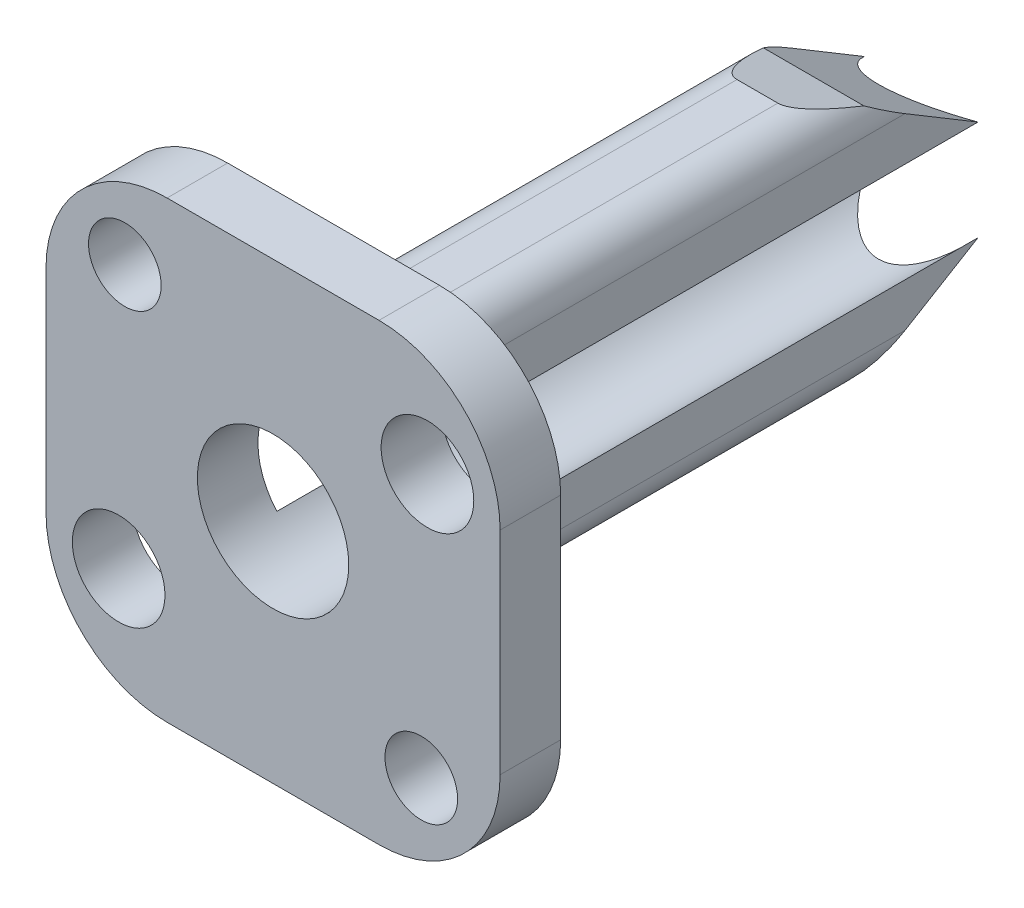
ISO-10303-21;
HEADER;
FILE_DESCRIPTION(('STEP AP214'),'2;1');
FILE_NAME('part.step','',(''),(''),'','','');
FILE_SCHEMA(('AUTOMOTIVE_DESIGN { 1 0 10303 214 1 1 1 1 }'));
ENDSEC;
DATA;
#1=APPLICATION_CONTEXT('core data for automotive mechanical design processes');
#2=APPLICATION_PROTOCOL_DEFINITION('international standard','automotive_design',2000,#1);
#3=PRODUCT_CONTEXT('',#1,'mechanical');
#4=PRODUCT('Part','Part','',(#3));
#5=PRODUCT_RELATED_PRODUCT_CATEGORY('part','',(#4));
#6=PRODUCT_DEFINITION_FORMATION('','',#4);
#7=PRODUCT_DEFINITION_CONTEXT('part definition',#1,'design');
#8=PRODUCT_DEFINITION('design','',#6,#7);
#9=PRODUCT_DEFINITION_SHAPE('','',#8);
#10=(LENGTH_UNIT() NAMED_UNIT(*) SI_UNIT(.MILLI.,.METRE.));
#11=(NAMED_UNIT(*) PLANE_ANGLE_UNIT() SI_UNIT($,.RADIAN.));
#12=(NAMED_UNIT(*) SI_UNIT($,.STERADIAN.) SOLID_ANGLE_UNIT());
#13=UNCERTAINTY_MEASURE_WITH_UNIT(LENGTH_MEASURE(1.E-05),#10,'distance_accuracy_value','');
#14=(GEOMETRIC_REPRESENTATION_CONTEXT(3) GLOBAL_UNCERTAINTY_ASSIGNED_CONTEXT((#13)) GLOBAL_UNIT_ASSIGNED_CONTEXT((#10,
#11,#12)) REPRESENTATION_CONTEXT('',''));
#15=CARTESIAN_POINT('',(0.,0.,0.));
#16=DIRECTION('',(0.,0.,1.));
#17=DIRECTION('',(1.,0.,0.));
#18=AXIS2_PLACEMENT_3D('',#15,#16,#17);
#19=CARTESIAN_POINT('',(0.,0.,0.));
#20=DIRECTION('',(0.,0.,1.));
#21=DIRECTION('',(1.,0.,0.));
#22=AXIS2_PLACEMENT_3D('',#19,#20,#21);
#23=PLANE('',#22);
#24=CARTESIAN_POINT('',(24.48,-24.48,0.));
#25=DIRECTION('',(0.,0.,1.));
#26=DIRECTION('',(1.,0.,0.));
#27=AXIS2_PLACEMENT_3D('',#24,#25,#26);
#28=CIRCLE('',#27,6.);
#29=CARTESIAN_POINT('',(30.48,-24.48,0.));
#30=VERTEX_POINT('',#29);
#31=EDGE_CURVE('E734',#30,#30,#28,.T.);
#32=ORIENTED_EDGE('',*,*,#31,.T.);
#33=EDGE_LOOP('',(#32));
#34=FACE_BOUND('',#33,.T.);
#35=CARTESIAN_POINT('',(-25.5,-19.5,0.));
#36=DIRECTION('',(0.,0.,1.));
#37=DIRECTION('',(1.,0.,0.));
#38=AXIS2_PLACEMENT_3D('',#35,#36,#37);
#39=CIRCLE('',#38,7.65);
#40=CARTESIAN_POINT('',(-17.85,-19.5,0.));
#41=VERTEX_POINT('',#40);
#42=EDGE_CURVE('E737',#41,#41,#39,.T.);
#43=ORIENTED_EDGE('',*,*,#42,.T.);
#44=EDGE_LOOP('',(#43));
#45=FACE_BOUND('',#44,.T.);
#46=CARTESIAN_POINT('',(-24.48,24.48,0.));
#47=DIRECTION('',(0.,0.,1.));
#48=DIRECTION('',(1.,0.,0.));
#49=AXIS2_PLACEMENT_3D('',#46,#47,#48);
#50=CIRCLE('',#49,6.);
#51=CARTESIAN_POINT('',(-18.48,24.48,0.));
#52=VERTEX_POINT('',#51);
#53=EDGE_CURVE('E697',#52,#52,#50,.T.);
#54=ORIENTED_EDGE('',*,*,#53,.T.);
#55=EDGE_LOOP('',(#54));
#56=FACE_BOUND('',#55,.T.);
#57=CARTESIAN_POINT('',(25.5,19.5,0.));
#58=DIRECTION('',(0.,0.,1.));
#59=DIRECTION('',(1.,0.,0.));
#60=AXIS2_PLACEMENT_3D('',#57,#58,#59);
#61=CIRCLE('',#60,7.65);
#62=CARTESIAN_POINT('',(33.15,19.5,0.));
#63=VERTEX_POINT('',#62);
#64=EDGE_CURVE('E207',#63,#63,#61,.T.);
#65=ORIENTED_EDGE('',*,*,#64,.T.);
#66=EDGE_LOOP('',(#65));
#67=FACE_BOUND('',#66,.T.);
#68=CARTESIAN_POINT('',(0.,0.,0.));
#69=DIRECTION('',(0.,0.,1.));
#70=DIRECTION('',(1.,0.,0.));
#71=AXIS2_PLACEMENT_3D('',#68,#69,#70);
#72=CIRCLE('',#71,12.5);
#73=CARTESIAN_POINT('',(-9.375,8.26797284707684,0.));
#74=VERTEX_POINT('',#73);
#75=CARTESIAN_POINT('',(-9.375,-8.26797284707685,0.));
#76=VERTEX_POINT('',#75);
#77=EDGE_CURVE('E206',#74,#76,#72,.T.);
#78=ORIENTED_EDGE('',*,*,#77,.T.);
#79=DIRECTION('',(0.,1.,0.));
#80=VECTOR('',#79,1.);
#81=CARTESIAN_POINT('',(-9.375,0.,0.));
#82=LINE('',#81,#80);
#83=CARTESIAN_POINT('',(-9.375,-15.5,0.));
#84=VERTEX_POINT('',#83);
#85=EDGE_CURVE('E240',#84,#76,#82,.T.);
#86=ORIENTED_EDGE('',*,*,#85,.F.);
#87=CARTESIAN_POINT('',(-3.375,-15.5,0.));
#88=DIRECTION('',(0.,0.,1.));
#89=DIRECTION('',(1.,0.,0.));
#90=AXIS2_PLACEMENT_3D('',#87,#88,#89);
#91=CIRCLE('',#90,6.);
#92=CARTESIAN_POINT('',(-3.375,-21.5,0.));
#93=VERTEX_POINT('',#92);
#94=EDGE_CURVE('E328',#84,#93,#91,.T.);
#95=ORIENTED_EDGE('',*,*,#94,.T.);
#96=DIRECTION('',(-1.,0.,0.));
#97=VECTOR('',#96,1.);
#98=CARTESIAN_POINT('',(0.,-21.5,0.));
#99=LINE('',#98,#97);
#100=CARTESIAN_POINT('',(3.375,-21.5,0.));
#101=VERTEX_POINT('',#100);
#102=EDGE_CURVE('E702',#101,#93,#99,.T.);
#103=ORIENTED_EDGE('',*,*,#102,.F.);
#104=CARTESIAN_POINT('',(3.375,-15.5,0.));
#105=DIRECTION('',(0.,0.,1.));
#106=DIRECTION('',(1.,0.,0.));
#107=AXIS2_PLACEMENT_3D('',#104,#105,#106);
#108=CIRCLE('',#107,6.);
#109=CARTESIAN_POINT('',(9.375,-15.5,0.));
#110=VERTEX_POINT('',#109);
#111=EDGE_CURVE('E330',#101,#110,#108,.T.);
#112=ORIENTED_EDGE('',*,*,#111,.T.);
#113=DIRECTION('',(0.,1.,0.));
#114=VECTOR('',#113,1.);
#115=CARTESIAN_POINT('',(9.375,0.,0.));
#116=LINE('',#115,#114);
#117=CARTESIAN_POINT('',(9.375,-8.26797284707684,0.));
#118=VERTEX_POINT('',#117);
#119=EDGE_CURVE('E202',#110,#118,#116,.T.);
#120=ORIENTED_EDGE('',*,*,#119,.T.);
#121=CARTESIAN_POINT('',(9.375,8.26797284707684,0.));
#122=VERTEX_POINT('',#121);
#123=EDGE_CURVE('E195',#118,#122,#72,.T.);
#124=ORIENTED_EDGE('',*,*,#123,.T.);
#125=DIRECTION('',(0.,1.,0.));
#126=VECTOR('',#125,1.);
#127=CARTESIAN_POINT('',(9.375,0.,0.));
#128=LINE('',#127,#126);
#129=CARTESIAN_POINT('',(9.375,15.5,0.));
#130=VERTEX_POINT('',#129);
#131=EDGE_CURVE('E200',#122,#130,#128,.T.);
#132=ORIENTED_EDGE('',*,*,#131,.T.);
#133=CARTESIAN_POINT('',(3.375,15.5,0.));
#134=DIRECTION('',(0.,0.,1.));
#135=DIRECTION('',(1.,0.,0.));
#136=AXIS2_PLACEMENT_3D('',#133,#134,#135);
#137=CIRCLE('',#136,6.);
#138=CARTESIAN_POINT('',(3.375,21.5,0.));
#139=VERTEX_POINT('',#138);
#140=EDGE_CURVE('E324',#130,#139,#137,.T.);
#141=ORIENTED_EDGE('',*,*,#140,.T.);
#142=DIRECTION('',(-1.,0.,0.));
#143=VECTOR('',#142,1.);
#144=CARTESIAN_POINT('',(0.,21.5,0.));
#145=LINE('',#144,#143);
#146=CARTESIAN_POINT('',(-3.375,21.5,0.));
#147=VERTEX_POINT('',#146);
#148=EDGE_CURVE('E226',#139,#147,#145,.T.);
#149=ORIENTED_EDGE('',*,*,#148,.T.);
#150=CARTESIAN_POINT('',(-3.375,15.5,0.));
#151=DIRECTION('',(0.,0.,1.));
#152=DIRECTION('',(1.,0.,0.));
#153=AXIS2_PLACEMENT_3D('',#150,#151,#152);
#154=CIRCLE('',#153,6.);
#155=CARTESIAN_POINT('',(-9.375,15.5,0.));
#156=VERTEX_POINT('',#155);
#157=EDGE_CURVE('E326',#147,#156,#154,.T.);
#158=ORIENTED_EDGE('',*,*,#157,.T.);
#159=DIRECTION('',(0.,1.,0.));
#160=VECTOR('',#159,1.);
#161=CARTESIAN_POINT('',(-9.375,0.,0.));
#162=LINE('',#161,#160);
#163=EDGE_CURVE('E220',#74,#156,#162,.T.);
#164=ORIENTED_EDGE('',*,*,#163,.F.);
#165=EDGE_LOOP('',(#78,#86,#95,#103,#112,#120,#124,#132,#141,#149,#158,#164));
#166=FACE_BOUND('',#165,.T.);
#167=DIRECTION('',(0.,1.,0.));
#168=VECTOR('',#167,1.);
#169=CARTESIAN_POINT('',(-37.5,0.,0.));
#170=LINE('',#169,#168);
#171=CARTESIAN_POINT('',(-37.5,-17.5,0.));
#172=VERTEX_POINT('',#171);
#173=CARTESIAN_POINT('',(-37.5,17.5,0.));
#174=VERTEX_POINT('',#173);
#175=EDGE_CURVE('E262',#172,#174,#170,.T.);
#176=ORIENTED_EDGE('',*,*,#175,.T.);
#177=CARTESIAN_POINT('',(-17.5,17.5,0.));
#178=DIRECTION('',(0.,0.,1.));
#179=DIRECTION('',(1.,0.,0.));
#180=AXIS2_PLACEMENT_3D('',#177,#178,#179);
#181=CIRCLE('',#180,20.);
#182=CARTESIAN_POINT('',(-17.5,37.5,0.));
#183=VERTEX_POINT('',#182);
#184=EDGE_CURVE('E343',#174,#183,#181,.F.);
#185=ORIENTED_EDGE('',*,*,#184,.T.);
#186=DIRECTION('',(-1.,0.,0.));
#187=VECTOR('',#186,1.);
#188=CARTESIAN_POINT('',(0.,37.5,0.));
#189=LINE('',#188,#187);
#190=CARTESIAN_POINT('',(17.5,37.5,0.));
#191=VERTEX_POINT('',#190);
#192=EDGE_CURVE('E258',#191,#183,#189,.T.);
#193=ORIENTED_EDGE('',*,*,#192,.F.);
#194=CARTESIAN_POINT('',(17.5,17.5,0.));
#195=DIRECTION('',(0.,0.,1.));
#196=DIRECTION('',(1.,0.,0.));
#197=AXIS2_PLACEMENT_3D('',#194,#195,#196);
#198=CIRCLE('',#197,20.);
#199=CARTESIAN_POINT('',(37.5,17.5,0.));
#200=VERTEX_POINT('',#199);
#201=EDGE_CURVE('E341',#191,#200,#198,.F.);
#202=ORIENTED_EDGE('',*,*,#201,.T.);
#203=DIRECTION('',(0.,1.,0.));
#204=VECTOR('',#203,1.);
#205=CARTESIAN_POINT('',(37.5,0.,0.));
#206=LINE('',#205,#204);
#207=CARTESIAN_POINT('',(37.5,-17.5,0.));
#208=VERTEX_POINT('',#207);
#209=EDGE_CURVE('E255',#208,#200,#206,.T.);
#210=ORIENTED_EDGE('',*,*,#209,.F.);
#211=CARTESIAN_POINT('',(17.5,-17.5,0.));
#212=DIRECTION('',(0.,0.,1.));
#213=DIRECTION('',(1.,0.,0.));
#214=AXIS2_PLACEMENT_3D('',#211,#212,#213);
#215=CIRCLE('',#214,20.);
#216=CARTESIAN_POINT('',(17.5,-37.5,0.));
#217=VERTEX_POINT('',#216);
#218=EDGE_CURVE('E337',#208,#217,#215,.F.);
#219=ORIENTED_EDGE('',*,*,#218,.T.);
#220=DIRECTION('',(-1.,0.,0.));
#221=VECTOR('',#220,1.);
#222=CARTESIAN_POINT('',(0.,-37.5,0.));
#223=LINE('',#222,#221);
#224=CARTESIAN_POINT('',(-17.5,-37.5,0.));
#225=VERTEX_POINT('',#224);
#226=EDGE_CURVE('E246',#217,#225,#223,.T.);
#227=ORIENTED_EDGE('',*,*,#226,.T.);
#228=CARTESIAN_POINT('',(-17.5,-17.5,0.));
#229=DIRECTION('',(0.,0.,1.));
#230=DIRECTION('',(1.,0.,0.));
#231=AXIS2_PLACEMENT_3D('',#228,#229,#230);
#232=CIRCLE('',#231,20.);
#233=EDGE_CURVE('E339',#225,#172,#232,.F.);
#234=ORIENTED_EDGE('',*,*,#233,.T.);
#235=EDGE_LOOP('',(#176,#185,#193,#202,#210,#219,#227,#234));
#236=FACE_BOUND('',#235,.T.);
#237=ADVANCED_FACE('F45',(#34,#45,#56,#67,#166,#236),#23,.F.);
#238=CARTESIAN_POINT('',(37.5,0.,10.));
#239=DIRECTION('',(-1.,0.,0.));
#240=DIRECTION('',(0.,-1.,0.));
#241=AXIS2_PLACEMENT_3D('',#238,#239,#240);
#242=PLANE('',#241);
#243=ORIENTED_EDGE('',*,*,#209,.T.);
#244=DIRECTION('',(0.,0.,-1.));
#245=VECTOR('',#244,1.);
#246=CARTESIAN_POINT('',(37.5,17.5,10.));
#247=LINE('',#246,#245);
#248=CARTESIAN_POINT('',(37.5,17.5,10.));
#249=VERTEX_POINT('',#248);
#250=EDGE_CURVE('E360',#200,#249,#247,.F.);
#251=ORIENTED_EDGE('',*,*,#250,.T.);
#252=DIRECTION('',(0.,1.,0.));
#253=VECTOR('',#252,1.);
#254=CARTESIAN_POINT('',(37.5,0.,10.));
#255=LINE('',#254,#253);
#256=CARTESIAN_POINT('',(37.5,-17.5,10.));
#257=VERTEX_POINT('',#256);
#258=EDGE_CURVE('E242',#257,#249,#255,.T.);
#259=ORIENTED_EDGE('',*,*,#258,.F.);
#260=DIRECTION('',(0.,0.,-1.));
#261=VECTOR('',#260,1.);
#262=CARTESIAN_POINT('',(37.5,-17.5,0.));
#263=LINE('',#262,#261);
#264=EDGE_CURVE('E357',#257,#208,#263,.T.);
#265=ORIENTED_EDGE('',*,*,#264,.T.);
#266=EDGE_LOOP('',(#243,#251,#259,#265));
#267=FACE_BOUND('',#266,.T.);
#268=ADVANCED_FACE('F364',(#267),#242,.F.);
#269=CARTESIAN_POINT('',(0.,37.5,10.));
#270=DIRECTION('',(0.,-1.,0.));
#271=DIRECTION('',(0.,0.,-1.));
#272=AXIS2_PLACEMENT_3D('',#269,#270,#271);
#273=PLANE('',#272);
#274=ORIENTED_EDGE('',*,*,#192,.T.);
#275=DIRECTION('',(0.,0.,-1.));
#276=VECTOR('',#275,1.);
#277=CARTESIAN_POINT('',(-17.5,37.5,10.));
#278=LINE('',#277,#276);
#279=CARTESIAN_POINT('',(-17.5,37.5,10.));
#280=VERTEX_POINT('',#279);
#281=EDGE_CURVE('E348',#183,#280,#278,.F.);
#282=ORIENTED_EDGE('',*,*,#281,.T.);
#283=DIRECTION('',(-1.,0.,0.));
#284=VECTOR('',#283,1.);
#285=CARTESIAN_POINT('',(0.,37.5,10.));
#286=LINE('',#285,#284);
#287=CARTESIAN_POINT('',(17.5,37.5,10.));
#288=VERTEX_POINT('',#287);
#289=EDGE_CURVE('E245',#288,#280,#286,.T.);
#290=ORIENTED_EDGE('',*,*,#289,.F.);
#291=DIRECTION('',(0.,0.,-1.));
#292=VECTOR('',#291,1.);
#293=CARTESIAN_POINT('',(17.5,37.5,10.));
#294=LINE('',#293,#292);
#295=EDGE_CURVE('E345',#288,#191,#294,.T.);
#296=ORIENTED_EDGE('',*,*,#295,.T.);
#297=EDGE_LOOP('',(#274,#282,#290,#296));
#298=FACE_BOUND('',#297,.T.);
#299=ADVANCED_FACE('F376',(#298),#273,.F.);
#300=CARTESIAN_POINT('',(-37.5,0.,10.));
#301=DIRECTION('',(-1.,0.,0.));
#302=DIRECTION('',(0.,-1.,0.));
#303=AXIS2_PLACEMENT_3D('',#300,#301,#302);
#304=PLANE('',#303);
#305=DIRECTION('',(0.,1.,0.));
#306=VECTOR('',#305,1.);
#307=CARTESIAN_POINT('',(-37.5,0.,10.));
#308=LINE('',#307,#306);
#309=CARTESIAN_POINT('',(-37.5,-17.5,10.));
#310=VERTEX_POINT('',#309);
#311=CARTESIAN_POINT('',(-37.5,17.5,10.));
#312=VERTEX_POINT('',#311);
#313=EDGE_CURVE('E249',#310,#312,#308,.T.);
#314=ORIENTED_EDGE('',*,*,#313,.T.);
#315=DIRECTION('',(0.,0.,-1.));
#316=VECTOR('',#315,1.);
#317=CARTESIAN_POINT('',(-37.5,17.5,0.));
#318=LINE('',#317,#316);
#319=EDGE_CURVE('E334',#312,#174,#318,.T.);
#320=ORIENTED_EDGE('',*,*,#319,.T.);
#321=ORIENTED_EDGE('',*,*,#175,.F.);
#322=DIRECTION('',(0.,0.,-1.));
#323=VECTOR('',#322,1.);
#324=CARTESIAN_POINT('',(-37.5,-17.5,10.));
#325=LINE('',#324,#323);
#326=EDGE_CURVE('E332',#172,#310,#325,.F.);
#327=ORIENTED_EDGE('',*,*,#326,.T.);
#328=EDGE_LOOP('',(#314,#320,#321,#327));
#329=FACE_BOUND('',#328,.T.);
#330=ADVANCED_FACE('F384',(#329),#304,.T.);
#331=CARTESIAN_POINT('',(0.,-37.5,10.));
#332=DIRECTION('',(0.,-1.,0.));
#333=DIRECTION('',(1.,0.,0.));
#334=AXIS2_PLACEMENT_3D('',#331,#332,#333);
#335=PLANE('',#334);
#336=DIRECTION('',(-1.,0.,0.));
#337=VECTOR('',#336,1.);
#338=CARTESIAN_POINT('',(0.,-37.5,10.));
#339=LINE('',#338,#337);
#340=CARTESIAN_POINT('',(17.5,-37.5,10.));
#341=VERTEX_POINT('',#340);
#342=CARTESIAN_POINT('',(-17.5,-37.5,10.));
#343=VERTEX_POINT('',#342);
#344=EDGE_CURVE('E252',#341,#343,#339,.T.);
#345=ORIENTED_EDGE('',*,*,#344,.T.);
#346=DIRECTION('',(0.,0.,-1.));
#347=VECTOR('',#346,1.);
#348=CARTESIAN_POINT('',(-17.5,-37.5,10.));
#349=LINE('',#348,#347);
#350=EDGE_CURVE('E11',#343,#225,#349,.T.);
#351=ORIENTED_EDGE('',*,*,#350,.T.);
#352=ORIENTED_EDGE('',*,*,#226,.F.);
#353=DIRECTION('',(0.,0.,-1.));
#354=VECTOR('',#353,1.);
#355=CARTESIAN_POINT('',(17.5,-37.5,10.));
#356=LINE('',#355,#354);
#357=EDGE_CURVE('E53',#217,#341,#356,.F.);
#358=ORIENTED_EDGE('',*,*,#357,.T.);
#359=EDGE_LOOP('',(#345,#351,#352,#358));
#360=FACE_BOUND('',#359,.T.);
#361=ADVANCED_FACE('F389',(#360),#335,.T.);
#362=CARTESIAN_POINT('',(0.,0.,10.));
#363=DIRECTION('',(0.,0.,1.));
#364=DIRECTION('',(1.,0.,0.));
#365=AXIS2_PLACEMENT_3D('',#362,#363,#364);
#366=PLANE('',#365);
#367=CARTESIAN_POINT('',(24.48,-24.48,10.));
#368=DIRECTION('',(0.,0.,1.));
#369=DIRECTION('',(1.,0.,0.));
#370=AXIS2_PLACEMENT_3D('',#367,#368,#369);
#371=CIRCLE('',#370,6.);
#372=CARTESIAN_POINT('',(30.48,-24.48,10.));
#373=VERTEX_POINT('',#372);
#374=EDGE_CURVE('E679',#373,#373,#371,.T.);
#375=ORIENTED_EDGE('',*,*,#374,.F.);
#376=EDGE_LOOP('',(#375));
#377=FACE_BOUND('',#376,.T.);
#378=CARTESIAN_POINT('',(-25.5,-19.5,10.));
#379=DIRECTION('',(0.,0.,1.));
#380=DIRECTION('',(1.,0.,0.));
#381=AXIS2_PLACEMENT_3D('',#378,#379,#380);
#382=CIRCLE('',#381,7.65);
#383=CARTESIAN_POINT('',(-17.85,-19.5,10.));
#384=VERTEX_POINT('',#383);
#385=EDGE_CURVE('E683',#384,#384,#382,.T.);
#386=ORIENTED_EDGE('',*,*,#385,.F.);
#387=EDGE_LOOP('',(#386));
#388=FACE_BOUND('',#387,.T.);
#389=CARTESIAN_POINT('',(-24.48,24.48,10.));
#390=DIRECTION('',(0.,0.,1.));
#391=DIRECTION('',(1.,0.,0.));
#392=AXIS2_PLACEMENT_3D('',#389,#390,#391);
#393=CIRCLE('',#392,6.);
#394=CARTESIAN_POINT('',(-18.48,24.48,10.));
#395=VERTEX_POINT('',#394);
#396=EDGE_CURVE('E687',#395,#395,#393,.T.);
#397=ORIENTED_EDGE('',*,*,#396,.F.);
#398=EDGE_LOOP('',(#397));
#399=FACE_BOUND('',#398,.T.);
#400=CARTESIAN_POINT('',(25.5,19.5,10.));
#401=DIRECTION('',(0.,0.,1.));
#402=DIRECTION('',(1.,0.,0.));
#403=AXIS2_PLACEMENT_3D('',#400,#401,#402);
#404=CIRCLE('',#403,7.65);
#405=CARTESIAN_POINT('',(33.15,19.5,10.));
#406=VERTEX_POINT('',#405);
#407=EDGE_CURVE('E691',#406,#406,#404,.T.);
#408=ORIENTED_EDGE('',*,*,#407,.F.);
#409=EDGE_LOOP('',(#408));
#410=FACE_BOUND('',#409,.T.);
#411=CARTESIAN_POINT('',(0.,0.,10.));
#412=DIRECTION('',(0.,0.,1.));
#413=DIRECTION('',(1.,0.,0.));
#414=AXIS2_PLACEMENT_3D('',#411,#412,#413);
#415=CIRCLE('',#414,12.5);
#416=CARTESIAN_POINT('',(12.5,0.,10.));
#417=VERTEX_POINT('',#416);
#418=EDGE_CURVE('E227',#417,#417,#415,.T.);
#419=ORIENTED_EDGE('',*,*,#418,.F.);
#420=EDGE_LOOP('',(#419));
#421=FACE_BOUND('',#420,.T.);
#422=ORIENTED_EDGE('',*,*,#289,.T.);
#423=CARTESIAN_POINT('',(-17.5,17.5,10.));
#424=DIRECTION('',(0.,0.,1.));
#425=DIRECTION('',(1.,0.,0.));
#426=AXIS2_PLACEMENT_3D('',#423,#424,#425);
#427=CIRCLE('',#426,20.);
#428=EDGE_CURVE('E355',#280,#312,#427,.T.);
#429=ORIENTED_EDGE('',*,*,#428,.T.);
#430=ORIENTED_EDGE('',*,*,#313,.F.);
#431=CARTESIAN_POINT('',(-17.5,-17.5,10.));
#432=DIRECTION('',(0.,0.,1.));
#433=DIRECTION('',(1.,0.,0.));
#434=AXIS2_PLACEMENT_3D('',#431,#432,#433);
#435=CIRCLE('',#434,20.);
#436=EDGE_CURVE('E60',#310,#343,#435,.T.);
#437=ORIENTED_EDGE('',*,*,#436,.T.);
#438=ORIENTED_EDGE('',*,*,#344,.F.);
#439=CARTESIAN_POINT('',(17.5,-17.5,10.));
#440=DIRECTION('',(0.,0.,1.));
#441=DIRECTION('',(1.,0.,0.));
#442=AXIS2_PLACEMENT_3D('',#439,#440,#441);
#443=CIRCLE('',#442,20.);
#444=EDGE_CURVE('E350',#341,#257,#443,.T.);
#445=ORIENTED_EDGE('',*,*,#444,.T.);
#446=ORIENTED_EDGE('',*,*,#258,.T.);
#447=CARTESIAN_POINT('',(17.5,17.5,10.));
#448=DIRECTION('',(0.,0.,1.));
#449=DIRECTION('',(1.,0.,0.));
#450=AXIS2_PLACEMENT_3D('',#447,#448,#449);
#451=CIRCLE('',#450,20.);
#452=EDGE_CURVE('E353',#249,#288,#451,.T.);
#453=ORIENTED_EDGE('',*,*,#452,.T.);
#454=EDGE_LOOP('',(#422,#429,#430,#437,#438,#445,#446,#453));
#455=FACE_BOUND('',#454,.T.);
#456=ADVANCED_FACE('F369',(#377,#388,#399,#410,#421,#455),#366,.T.);
#457=CARTESIAN_POINT('',(-9.375,0.,-100.));
#458=DIRECTION('',(1.,0.,0.));
#459=DIRECTION('',(0.,1.,0.));
#460=AXIS2_PLACEMENT_3D('',#457,#458,#459);
#461=PLANE('',#460);
#462=ORIENTED_EDGE('',*,*,#163,.T.);
#463=DIRECTION('',(0.,0.,1.));
#464=VECTOR('',#463,1.);
#465=CARTESIAN_POINT('',(-9.375,15.5,-69.9999999999998));
#466=LINE('',#465,#464);
#467=CARTESIAN_POINT('',(-9.375,15.5,-84.9999999999998));
#468=VERTEX_POINT('',#467);
#469=EDGE_CURVE('E304',#156,#468,#466,.F.);
#470=ORIENTED_EDGE('',*,*,#469,.T.);
#471=DIRECTION('',(0.,-0.514495755427529,-0.857492925712543));
#472=VECTOR('',#471,1.);
#473=CARTESIAN_POINT('',(-9.37500000000001,21.5,-74.9999999999999));
#474=LINE('',#473,#472);
#475=CARTESIAN_POINT('',(-9.375,8.26797284707684,-97.053378588205));
#476=VERTEX_POINT('',#475);
#477=EDGE_CURVE('E254',#468,#476,#474,.T.);
#478=ORIENTED_EDGE('',*,*,#477,.T.);
#479=DIRECTION('',(0.,0.,1.));
#480=VECTOR('',#479,1.);
#481=CARTESIAN_POINT('',(-9.375,8.26797284707684,-100.));
#482=LINE('',#481,#480);
#483=EDGE_CURVE('E219',#476,#74,#482,.T.);
#484=ORIENTED_EDGE('',*,*,#483,.T.);
#485=EDGE_LOOP('',(#462,#470,#478,#484));
#486=FACE_BOUND('',#485,.T.);
#487=ADVANCED_FACE('F535',(#486),#461,.F.);
#488=CARTESIAN_POINT('',(0.,21.5,-100.));
#489=DIRECTION('',(0.,1.,0.));
#490=DIRECTION('',(0.,0.,1.));
#491=AXIS2_PLACEMENT_3D('',#488,#489,#490);
#492=PLANE('',#491);
#493=ORIENTED_EDGE('',*,*,#148,.F.);
#494=DIRECTION('',(0.,0.,1.));
#495=VECTOR('',#494,1.);
#496=CARTESIAN_POINT('',(3.375,21.5,-100.));
#497=LINE('',#496,#495);
#498=CARTESIAN_POINT('',(3.375,21.5,-69.9999999999998));
#499=VERTEX_POINT('',#498);
#500=EDGE_CURVE('E294',#139,#499,#497,.F.);
#501=ORIENTED_EDGE('',*,*,#500,.T.);
#502=DIRECTION('',(-1.,0.,0.));
#503=VECTOR('',#502,1.);
#504=CARTESIAN_POINT('',(0.,21.5,-69.9999999999998));
#505=LINE('',#504,#503);
#506=CARTESIAN_POINT('',(-3.375,21.5,-69.9999999999998));
#507=VERTEX_POINT('',#506);
#508=EDGE_CURVE('E278',#499,#507,#505,.T.);
#509=ORIENTED_EDGE('',*,*,#508,.T.);
#510=DIRECTION('',(0.,0.,1.));
#511=VECTOR('',#510,1.);
#512=CARTESIAN_POINT('',(-3.375,21.5,0.));
#513=LINE('',#512,#511);
#514=EDGE_CURVE('E291',#507,#147,#513,.T.);
#515=ORIENTED_EDGE('',*,*,#514,.T.);
#516=EDGE_LOOP('',(#493,#501,#509,#515));
#517=FACE_BOUND('',#516,.T.);
#518=ADVANCED_FACE('F538',(#517),#492,.T.);
#519=CARTESIAN_POINT('',(9.375,0.,-100.));
#520=DIRECTION('',(1.,0.,0.));
#521=DIRECTION('',(0.,1.,0.));
#522=AXIS2_PLACEMENT_3D('',#519,#520,#521);
#523=PLANE('',#522);
#524=DIRECTION('',(0.,0.514495755427529,0.857492925712543));
#525=VECTOR('',#524,1.);
#526=CARTESIAN_POINT('',(9.375,4.77941176470572,-102.867647058823));
#527=LINE('',#526,#525);
#528=CARTESIAN_POINT('',(9.375,8.26797284707684,-97.053378588205));
#529=VERTEX_POINT('',#528);
#530=CARTESIAN_POINT('',(9.375,15.5,-84.9999999999998));
#531=VERTEX_POINT('',#530);
#532=EDGE_CURVE('E269',#529,#531,#527,.T.);
#533=ORIENTED_EDGE('',*,*,#532,.T.);
#534=DIRECTION('',(0.,0.,1.));
#535=VECTOR('',#534,1.);
#536=CARTESIAN_POINT('',(9.375,15.5,-100.));
#537=LINE('',#536,#535);
#538=EDGE_CURVE('E225',#531,#130,#537,.T.);
#539=ORIENTED_EDGE('',*,*,#538,.T.);
#540=ORIENTED_EDGE('',*,*,#131,.F.);
#541=DIRECTION('',(0.,0.,1.));
#542=VECTOR('',#541,1.);
#543=CARTESIAN_POINT('',(9.375,8.26797284707684,-100.));
#544=LINE('',#543,#542);
#545=EDGE_CURVE('E210',#529,#122,#544,.T.);
#546=ORIENTED_EDGE('',*,*,#545,.F.);
#547=EDGE_LOOP('',(#533,#539,#540,#546));
#548=FACE_BOUND('',#547,.T.);
#549=ADVANCED_FACE('F223',(#548),#523,.T.);
#550=CARTESIAN_POINT('',(0.,0.,-100.));
#551=DIRECTION('',(0.,0.,1.));
#552=DIRECTION('',(1.,0.,0.));
#553=AXIS2_PLACEMENT_3D('',#550,#551,#552);
#554=CYLINDRICAL_SURFACE('',#553,12.5);
#555=DIRECTION('',(0.,0.,1.));
#556=VECTOR('',#555,1.);
#557=CARTESIAN_POINT('',(9.375,-8.26797284707684,-100.));
#558=LINE('',#557,#556);
#559=CARTESIAN_POINT('',(9.375,-8.26797284707684,-97.053378588205));
#560=VERTEX_POINT('',#559);
#561=EDGE_CURVE('E259',#560,#118,#558,.T.);
#562=ORIENTED_EDGE('',*,*,#561,.F.);
#563=CARTESIAN_POINT('',(0.,0.,-110.833333333333));
#564=DIRECTION('',(0.,0.857492925712542,0.514495755427529));
#565=DIRECTION('',(0.,-0.514495755427529,0.857492925712543));
#566=AXIS2_PLACEMENT_3D('',#563,#564,#565);
#567=ELLIPSE('',#566,24.2956328951886,12.5);
#568=CARTESIAN_POINT('',(-9.375,-8.26797284707685,-97.053378588205));
#569=VERTEX_POINT('',#568);
#570=EDGE_CURVE('E271',#560,#569,#567,.F.);
#571=ORIENTED_EDGE('',*,*,#570,.T.);
#572=DIRECTION('',(0.,0.,1.));
#573=VECTOR('',#572,1.);
#574=CARTESIAN_POINT('',(-9.375,-8.26797284707685,-100.));
#575=LINE('',#574,#573);
#576=EDGE_CURVE('E234',#569,#76,#575,.T.);
#577=ORIENTED_EDGE('',*,*,#576,.T.);
#578=ORIENTED_EDGE('',*,*,#77,.F.);
#579=ORIENTED_EDGE('',*,*,#483,.F.);
#580=CARTESIAN_POINT('',(0.,0.,-110.833333333333));
#581=DIRECTION('',(0.,0.857492925712542,-0.514495755427529));
#582=DIRECTION('',(0.,0.514495755427529,0.857492925712543));
#583=AXIS2_PLACEMENT_3D('',#580,#581,#582);
#584=ELLIPSE('',#583,24.2956328951886,12.5);
#585=EDGE_CURVE('E215',#476,#529,#584,.T.);
#586=ORIENTED_EDGE('',*,*,#585,.T.);
#587=ORIENTED_EDGE('',*,*,#545,.T.);
#588=ORIENTED_EDGE('',*,*,#123,.F.);
#589=EDGE_LOOP('',(#562,#571,#577,#578,#579,#586,#587,#588));
#590=FACE_BOUND('',#589,.T.);
#591=ORIENTED_EDGE('',*,*,#418,.T.);
#592=EDGE_LOOP('',(#591));
#593=FACE_BOUND('',#592,.T.);
#594=ADVANCED_FACE('F211',(#590,#593),#554,.F.);
#595=CARTESIAN_POINT('',(9.375,0.,-100.));
#596=DIRECTION('',(1.,0.,0.));
#597=DIRECTION('',(0.,1.,0.));
#598=AXIS2_PLACEMENT_3D('',#595,#596,#597);
#599=PLANE('',#598);
#600=ORIENTED_EDGE('',*,*,#119,.F.);
#601=DIRECTION('',(0.,0.,1.));
#602=VECTOR('',#601,1.);
#603=CARTESIAN_POINT('',(9.375,-15.5,-69.9999999999998));
#604=LINE('',#603,#602);
#605=CARTESIAN_POINT('',(9.375,-15.5,-84.9999999999998));
#606=VERTEX_POINT('',#605);
#607=EDGE_CURVE('E322',#110,#606,#604,.F.);
#608=ORIENTED_EDGE('',*,*,#607,.T.);
#609=DIRECTION('',(0.,-0.514495755427529,0.857492925712543));
#610=VECTOR('',#609,1.);
#611=CARTESIAN_POINT('',(9.375,-4.77941176470574,-102.867647058823));
#612=LINE('',#611,#610);
#613=EDGE_CURVE('E276',#606,#560,#612,.F.);
#614=ORIENTED_EDGE('',*,*,#613,.T.);
#615=ORIENTED_EDGE('',*,*,#561,.T.);
#616=EDGE_LOOP('',(#600,#608,#614,#615));
#617=FACE_BOUND('',#616,.T.);
#618=ADVANCED_FACE('F522',(#617),#599,.T.);
#619=CARTESIAN_POINT('',(0.,-21.5,-100.));
#620=DIRECTION('',(0.,1.,0.));
#621=DIRECTION('',(-1.,0.,0.));
#622=AXIS2_PLACEMENT_3D('',#619,#620,#621);
#623=PLANE('',#622);
#624=ORIENTED_EDGE('',*,*,#102,.T.);
#625=DIRECTION('',(0.,0.,1.));
#626=VECTOR('',#625,1.);
#627=CARTESIAN_POINT('',(-3.375,-21.5,-100.));
#628=LINE('',#627,#626);
#629=CARTESIAN_POINT('',(-3.375,-21.5,-69.9999999999998));
#630=VERTEX_POINT('',#629);
#631=EDGE_CURVE('E312',#93,#630,#628,.F.);
#632=ORIENTED_EDGE('',*,*,#631,.T.);
#633=DIRECTION('',(1.,0.,0.));
#634=VECTOR('',#633,1.);
#635=CARTESIAN_POINT('',(9.375,-21.5,-69.9999999999998));
#636=LINE('',#635,#634);
#637=CARTESIAN_POINT('',(3.375,-21.5,-69.9999999999998));
#638=VERTEX_POINT('',#637);
#639=EDGE_CURVE('E284',#630,#638,#636,.T.);
#640=ORIENTED_EDGE('',*,*,#639,.T.);
#641=DIRECTION('',(0.,0.,1.));
#642=VECTOR('',#641,1.);
#643=CARTESIAN_POINT('',(3.375,-21.5,0.));
#644=LINE('',#643,#642);
#645=EDGE_CURVE('E309',#638,#101,#644,.T.);
#646=ORIENTED_EDGE('',*,*,#645,.T.);
#647=EDGE_LOOP('',(#624,#632,#640,#646));
#648=FACE_BOUND('',#647,.T.);
#649=ADVANCED_FACE('F525',(#648),#623,.F.);
#650=CARTESIAN_POINT('',(-9.375,0.,-100.));
#651=DIRECTION('',(1.,0.,0.));
#652=DIRECTION('',(0.,1.,0.));
#653=AXIS2_PLACEMENT_3D('',#650,#651,#652);
#654=PLANE('',#653);
#655=DIRECTION('',(0.,0.514495755427529,-0.857492925712543));
#656=VECTOR('',#655,1.);
#657=CARTESIAN_POINT('',(-9.375,-6.49999999999984,-100.));
#658=LINE('',#657,#656);
#659=CARTESIAN_POINT('',(-9.375,-15.5,-84.9999999999998));
#660=VERTEX_POINT('',#659);
#661=EDGE_CURVE('E273',#569,#660,#658,.F.);
#662=ORIENTED_EDGE('',*,*,#661,.T.);
#663=DIRECTION('',(0.,0.,1.));
#664=VECTOR('',#663,1.);
#665=CARTESIAN_POINT('',(-9.375,-15.5,-100.));
#666=LINE('',#665,#664);
#667=EDGE_CURVE('E306',#660,#84,#666,.T.);
#668=ORIENTED_EDGE('',*,*,#667,.T.);
#669=ORIENTED_EDGE('',*,*,#85,.T.);
#670=ORIENTED_EDGE('',*,*,#576,.F.);
#671=EDGE_LOOP('',(#662,#668,#669,#670));
#672=FACE_BOUND('',#671,.T.);
#673=ADVANCED_FACE('F427',(#672),#654,.F.);
#674=CARTESIAN_POINT('',(0.,21.5,-74.9999999999999));
#675=DIRECTION('',(0.,0.857492925712542,-0.514495755427529));
#676=DIRECTION('',(1.,0.,0.));
#677=AXIS2_PLACEMENT_3D('',#674,#675,#676);
#678=PLANE('',#677);
#679=DIRECTION('',(1.,0.,0.));
#680=VECTOR('',#679,1.);
#681=CARTESIAN_POINT('',(0.,18.9275212228623,-79.2874646285626));
#682=LINE('',#681,#680);
#683=CARTESIAN_POINT('',(-8.29964194300746,18.9275212228623,-79.2874646285626));
#684=VERTEX_POINT('',#683);
#685=CARTESIAN_POINT('',(8.29964194300746,18.9275212228623,-79.2874646285626));
#686=VERTEX_POINT('',#685);
#687=EDGE_CURVE('E281',#684,#686,#682,.T.);
#688=ORIENTED_EDGE('',*,*,#687,.T.);
#689=CARTESIAN_POINT('',(3.375,15.5,-84.9999999999998));
#690=DIRECTION('',(0.,0.857492925712542,-0.514495755427529));
#691=DIRECTION('',(0.,0.514495755427529,0.857492925712543));
#692=AXIS2_PLACEMENT_3D('',#689,#690,#691);
#693=ELLIPSE('',#692,11.6619037896905,6.);
#694=EDGE_CURVE('E302',#686,#531,#693,.T.);
#695=ORIENTED_EDGE('',*,*,#694,.T.);
#696=ORIENTED_EDGE('',*,*,#532,.F.);
#697=ORIENTED_EDGE('',*,*,#585,.F.);
#698=ORIENTED_EDGE('',*,*,#477,.F.);
#699=CARTESIAN_POINT('',(-3.375,15.5,-84.9999999999998));
#700=DIRECTION('',(0.,0.857492925712542,-0.514495755427529));
#701=DIRECTION('',(0.,-0.514495755427529,-0.857492925712543));
#702=AXIS2_PLACEMENT_3D('',#699,#700,#701);
#703=ELLIPSE('',#702,11.6619037896905,6.);
#704=EDGE_CURVE('E300',#468,#684,#703,.T.);
#705=ORIENTED_EDGE('',*,*,#704,.T.);
#706=EDGE_LOOP('',(#688,#695,#696,#697,#698,#705));
#707=FACE_BOUND('',#706,.T.);
#708=ADVANCED_FACE('F420',(#707),#678,.T.);
#709=CARTESIAN_POINT('',(0.,-6.49999999999984,-100.));
#710=DIRECTION('',(0.,0.857492925712542,0.514495755427529));
#711=DIRECTION('',(-1.,0.,0.));
#712=AXIS2_PLACEMENT_3D('',#709,#710,#711);
#713=PLANE('',#712);
#714=DIRECTION('',(1.,0.,0.));
#715=VECTOR('',#714,1.);
#716=CARTESIAN_POINT('',(-9.375,-18.9275212228624,-79.2874646285626));
#717=LINE('',#716,#715);
#718=CARTESIAN_POINT('',(8.29964194300746,-18.9275212228623,-79.2874646285626));
#719=VERTEX_POINT('',#718);
#720=CARTESIAN_POINT('',(-8.29964194300745,-18.9275212228624,-79.2874646285626));
#721=VERTEX_POINT('',#720);
#722=EDGE_CURVE('E287',#719,#721,#717,.F.);
#723=ORIENTED_EDGE('',*,*,#722,.T.);
#724=CARTESIAN_POINT('',(-3.375,-15.5,-84.9999999999998));
#725=DIRECTION('',(0.,0.857492925712542,0.514495755427529));
#726=DIRECTION('',(0.,-0.514495755427529,0.857492925712543));
#727=AXIS2_PLACEMENT_3D('',#724,#725,#726);
#728=ELLIPSE('',#727,11.6619037896905,6.);
#729=EDGE_CURVE('E320',#721,#660,#728,.F.);
#730=ORIENTED_EDGE('',*,*,#729,.T.);
#731=ORIENTED_EDGE('',*,*,#661,.F.);
#732=ORIENTED_EDGE('',*,*,#570,.F.);
#733=ORIENTED_EDGE('',*,*,#613,.F.);
#734=CARTESIAN_POINT('',(3.375,-15.5,-84.9999999999998));
#735=DIRECTION('',(0.,0.857492925712542,0.514495755427529));
#736=DIRECTION('',(0.,0.514495755427529,-0.857492925712543));
#737=AXIS2_PLACEMENT_3D('',#734,#735,#736);
#738=ELLIPSE('',#737,11.6619037896905,6.);
#739=EDGE_CURVE('E318',#606,#719,#738,.F.);
#740=ORIENTED_EDGE('',*,*,#739,.T.);
#741=EDGE_LOOP('',(#723,#730,#731,#732,#733,#740));
#742=FACE_BOUND('',#741,.T.);
#743=ADVANCED_FACE('F426',(#742),#713,.F.);
#744=CARTESIAN_POINT('',(0.,21.5,-69.9999999999998));
#745=DIRECTION('',(0.,-0.963714928210761,0.266933581895812));
#746=DIRECTION('',(-1.,0.,0.));
#747=AXIS2_PLACEMENT_3D('',#744,#745,#746);
#748=PLANE('',#747);
#749=ORIENTED_EDGE('',*,*,#508,.F.);
#750=CARTESIAN_POINT('',(3.375,15.5,-91.6619037896904));
#751=DIRECTION('',(0.,-0.963714928210761,0.266933581895812));
#752=DIRECTION('',(0.,0.266933581895812,0.963714928210761));
#753=AXIS2_PLACEMENT_3D('',#750,#751,#752);
#754=ELLIPSE('',#753,22.4775015469649,6.);
#755=EDGE_CURVE('E298',#499,#686,#754,.F.);
#756=ORIENTED_EDGE('',*,*,#755,.T.);
#757=ORIENTED_EDGE('',*,*,#687,.F.);
#758=CARTESIAN_POINT('',(-3.375,15.5,-91.6619037896904));
#759=DIRECTION('',(0.,-0.963714928210761,0.266933581895812));
#760=DIRECTION('',(0.,-0.266933581895812,-0.963714928210761));
#761=AXIS2_PLACEMENT_3D('',#758,#759,#760);
#762=ELLIPSE('',#761,22.4775015469649,6.);
#763=EDGE_CURVE('E296',#684,#507,#762,.F.);
#764=ORIENTED_EDGE('',*,*,#763,.T.);
#765=EDGE_LOOP('',(#749,#756,#757,#764));
#766=FACE_BOUND('',#765,.T.);
#767=ADVANCED_FACE('F434',(#766),#748,.F.);
#768=CARTESIAN_POINT('',(0.,-21.5,-69.9999999999998));
#769=DIRECTION('',(0.,0.963714928210761,0.266933581895812));
#770=DIRECTION('',(1.,0.,0.));
#771=AXIS2_PLACEMENT_3D('',#768,#769,#770);
#772=PLANE('',#771);
#773=ORIENTED_EDGE('',*,*,#639,.F.);
#774=CARTESIAN_POINT('',(-3.375,-15.5,-91.6619037896904));
#775=DIRECTION('',(0.,0.963714928210761,0.266933581895812));
#776=DIRECTION('',(0.,-0.266933581895812,0.963714928210761));
#777=AXIS2_PLACEMENT_3D('',#774,#775,#776);
#778=ELLIPSE('',#777,22.4775015469649,6.);
#779=EDGE_CURVE('E316',#630,#721,#778,.F.);
#780=ORIENTED_EDGE('',*,*,#779,.T.);
#781=ORIENTED_EDGE('',*,*,#722,.F.);
#782=CARTESIAN_POINT('',(3.375,-15.5,-91.6619037896904));
#783=DIRECTION('',(0.,0.963714928210761,0.266933581895812));
#784=DIRECTION('',(0.,0.266933581895812,-0.963714928210761));
#785=AXIS2_PLACEMENT_3D('',#782,#783,#784);
#786=ELLIPSE('',#785,22.4775015469649,6.);
#787=EDGE_CURVE('E314',#719,#638,#786,.F.);
#788=ORIENTED_EDGE('',*,*,#787,.T.);
#789=EDGE_LOOP('',(#773,#780,#781,#788));
#790=FACE_BOUND('',#789,.T.);
#791=ADVANCED_FACE('F441',(#790),#772,.F.);
#792=CARTESIAN_POINT('',(3.375,15.5,-100.));
#793=DIRECTION('',(0.,0.,1.));
#794=DIRECTION('',(1.,0.,0.));
#795=AXIS2_PLACEMENT_3D('',#792,#793,#794);
#796=CYLINDRICAL_SURFACE('',#795,6.);
#797=ORIENTED_EDGE('',*,*,#755,.F.);
#798=ORIENTED_EDGE('',*,*,#500,.F.);
#799=ORIENTED_EDGE('',*,*,#140,.F.);
#800=ORIENTED_EDGE('',*,*,#538,.F.);
#801=ORIENTED_EDGE('',*,*,#694,.F.);
#802=EDGE_LOOP('',(#797,#798,#799,#800,#801));
#803=FACE_BOUND('',#802,.T.);
#804=ADVANCED_FACE('F447',(#803),#796,.T.);
#805=CARTESIAN_POINT('',(-3.375,15.5,-100.));
#806=DIRECTION('',(0.,0.,-1.));
#807=DIRECTION('',(-1.,0.,0.));
#808=AXIS2_PLACEMENT_3D('',#805,#806,#807);
#809=CYLINDRICAL_SURFACE('',#808,6.);
#810=ORIENTED_EDGE('',*,*,#704,.F.);
#811=ORIENTED_EDGE('',*,*,#469,.F.);
#812=ORIENTED_EDGE('',*,*,#157,.F.);
#813=ORIENTED_EDGE('',*,*,#514,.F.);
#814=ORIENTED_EDGE('',*,*,#763,.F.);
#815=EDGE_LOOP('',(#810,#811,#812,#813,#814));
#816=FACE_BOUND('',#815,.T.);
#817=ADVANCED_FACE('F451',(#816),#809,.T.);
#818=CARTESIAN_POINT('',(-3.375,-15.5,-100.));
#819=DIRECTION('',(0.,0.,1.));
#820=DIRECTION('',(1.,0.,0.));
#821=AXIS2_PLACEMENT_3D('',#818,#819,#820);
#822=CYLINDRICAL_SURFACE('',#821,6.);
#823=ORIENTED_EDGE('',*,*,#779,.F.);
#824=ORIENTED_EDGE('',*,*,#631,.F.);
#825=ORIENTED_EDGE('',*,*,#94,.F.);
#826=ORIENTED_EDGE('',*,*,#667,.F.);
#827=ORIENTED_EDGE('',*,*,#729,.F.);
#828=EDGE_LOOP('',(#823,#824,#825,#826,#827));
#829=FACE_BOUND('',#828,.T.);
#830=ADVANCED_FACE('F455',(#829),#822,.T.);
#831=CARTESIAN_POINT('',(3.375,-15.5,-100.));
#832=DIRECTION('',(0.,0.,-1.));
#833=DIRECTION('',(-1.,0.,0.));
#834=AXIS2_PLACEMENT_3D('',#831,#832,#833);
#835=CYLINDRICAL_SURFACE('',#834,6.);
#836=ORIENTED_EDGE('',*,*,#739,.F.);
#837=ORIENTED_EDGE('',*,*,#607,.F.);
#838=ORIENTED_EDGE('',*,*,#111,.F.);
#839=ORIENTED_EDGE('',*,*,#645,.F.);
#840=ORIENTED_EDGE('',*,*,#787,.F.);
#841=EDGE_LOOP('',(#836,#837,#838,#839,#840));
#842=FACE_BOUND('',#841,.T.);
#843=ADVANCED_FACE('F459',(#842),#835,.T.);
#844=CARTESIAN_POINT('',(-17.5,17.5,10.));
#845=DIRECTION('',(0.,0.,1.));
#846=DIRECTION('',(1.,0.,0.));
#847=AXIS2_PLACEMENT_3D('',#844,#845,#846);
#848=CYLINDRICAL_SURFACE('',#847,20.);
#849=ORIENTED_EDGE('',*,*,#428,.F.);
#850=ORIENTED_EDGE('',*,*,#281,.F.);
#851=ORIENTED_EDGE('',*,*,#184,.F.);
#852=ORIENTED_EDGE('',*,*,#319,.F.);
#853=EDGE_LOOP('',(#849,#850,#851,#852));
#854=FACE_BOUND('',#853,.T.);
#855=ADVANCED_FACE('F382',(#854),#848,.T.);
#856=CARTESIAN_POINT('',(17.5,17.5,10.));
#857=DIRECTION('',(0.,0.,-1.));
#858=DIRECTION('',(-1.,0.,0.));
#859=AXIS2_PLACEMENT_3D('',#856,#857,#858);
#860=CYLINDRICAL_SURFACE('',#859,20.);
#861=ORIENTED_EDGE('',*,*,#452,.F.);
#862=ORIENTED_EDGE('',*,*,#250,.F.);
#863=ORIENTED_EDGE('',*,*,#201,.F.);
#864=ORIENTED_EDGE('',*,*,#295,.F.);
#865=EDGE_LOOP('',(#861,#862,#863,#864));
#866=FACE_BOUND('',#865,.T.);
#867=ADVANCED_FACE('F373',(#866),#860,.T.);
#868=CARTESIAN_POINT('',(-17.5,-17.5,10.));
#869=DIRECTION('',(0.,0.,-1.));
#870=DIRECTION('',(-1.,0.,0.));
#871=AXIS2_PLACEMENT_3D('',#868,#869,#870);
#872=CYLINDRICAL_SURFACE('',#871,20.);
#873=ORIENTED_EDGE('',*,*,#436,.F.);
#874=ORIENTED_EDGE('',*,*,#326,.F.);
#875=ORIENTED_EDGE('',*,*,#233,.F.);
#876=ORIENTED_EDGE('',*,*,#350,.F.);
#877=EDGE_LOOP('',(#873,#874,#875,#876));
#878=FACE_BOUND('',#877,.T.);
#879=ADVANCED_FACE('F388',(#878),#872,.T.);
#880=CARTESIAN_POINT('',(17.5,-17.5,10.));
#881=DIRECTION('',(0.,0.,1.));
#882=DIRECTION('',(1.,0.,0.));
#883=AXIS2_PLACEMENT_3D('',#880,#881,#882);
#884=CYLINDRICAL_SURFACE('',#883,20.);
#885=ORIENTED_EDGE('',*,*,#444,.F.);
#886=ORIENTED_EDGE('',*,*,#357,.F.);
#887=ORIENTED_EDGE('',*,*,#218,.F.);
#888=ORIENTED_EDGE('',*,*,#264,.F.);
#889=EDGE_LOOP('',(#885,#886,#887,#888));
#890=FACE_BOUND('',#889,.T.);
#891=ADVANCED_FACE('F47',(#890),#884,.T.);
#892=CARTESIAN_POINT('',(25.5,19.5,0.));
#893=DIRECTION('',(0.,0.,1.));
#894=DIRECTION('',(1.,0.,0.));
#895=AXIS2_PLACEMENT_3D('',#892,#893,#894);
#896=CYLINDRICAL_SURFACE('',#895,7.65);
#897=ORIENTED_EDGE('',*,*,#64,.F.);
#898=EDGE_LOOP('',(#897));
#899=FACE_BOUND('',#898,.T.);
#900=ORIENTED_EDGE('',*,*,#407,.T.);
#901=EDGE_LOOP('',(#900));
#902=FACE_BOUND('',#901,.T.);
#903=ADVANCED_FACE('F392',(#899,#902),#896,.F.);
#904=CARTESIAN_POINT('',(-24.48,24.48,0.));
#905=DIRECTION('',(0.,0.,1.));
#906=DIRECTION('',(1.,0.,0.));
#907=AXIS2_PLACEMENT_3D('',#904,#905,#906);
#908=CYLINDRICAL_SURFACE('',#907,6.);
#909=ORIENTED_EDGE('',*,*,#53,.F.);
#910=EDGE_LOOP('',(#909));
#911=FACE_BOUND('',#910,.T.);
#912=ORIENTED_EDGE('',*,*,#396,.T.);
#913=EDGE_LOOP('',(#912));
#914=FACE_BOUND('',#913,.T.);
#915=ADVANCED_FACE('F398',(#911,#914),#908,.F.);
#916=CARTESIAN_POINT('',(-25.5,-19.5,0.));
#917=DIRECTION('',(0.,0.,1.));
#918=DIRECTION('',(1.,0.,0.));
#919=AXIS2_PLACEMENT_3D('',#916,#917,#918);
#920=CYLINDRICAL_SURFACE('',#919,7.65);
#921=ORIENTED_EDGE('',*,*,#42,.F.);
#922=EDGE_LOOP('',(#921));
#923=FACE_BOUND('',#922,.T.);
#924=ORIENTED_EDGE('',*,*,#385,.T.);
#925=EDGE_LOOP('',(#924));
#926=FACE_BOUND('',#925,.T.);
#927=ADVANCED_FACE('F496',(#923,#926),#920,.F.);
#928=CARTESIAN_POINT('',(24.48,-24.48,0.));
#929=DIRECTION('',(0.,0.,1.));
#930=DIRECTION('',(1.,0.,0.));
#931=AXIS2_PLACEMENT_3D('',#928,#929,#930);
#932=CYLINDRICAL_SURFACE('',#931,6.);
#933=ORIENTED_EDGE('',*,*,#31,.F.);
#934=EDGE_LOOP('',(#933));
#935=FACE_BOUND('',#934,.T.);
#936=ORIENTED_EDGE('',*,*,#374,.T.);
#937=EDGE_LOOP('',(#936));
#938=FACE_BOUND('',#937,.T.);
#939=ADVANCED_FACE('F506',(#935,#938),#932,.F.);
#940=CLOSED_SHELL('',(#237,#268,#299,#330,#361,#456,#487,#518,#549,#594,#618,#649,#673,#708,
#743,#767,#791,#804,#817,#830,#843,#855,#867,#879,#891,#903,#915,#927,#939));
#941=MANIFOLD_SOLID_BREP('B2',#940);
#942=ADVANCED_BREP_SHAPE_REPRESENTATION('',(#18,#941),#14);
#943=SHAPE_DEFINITION_REPRESENTATION(#9,#942);
ENDSEC;
END-ISO-10303-21;
